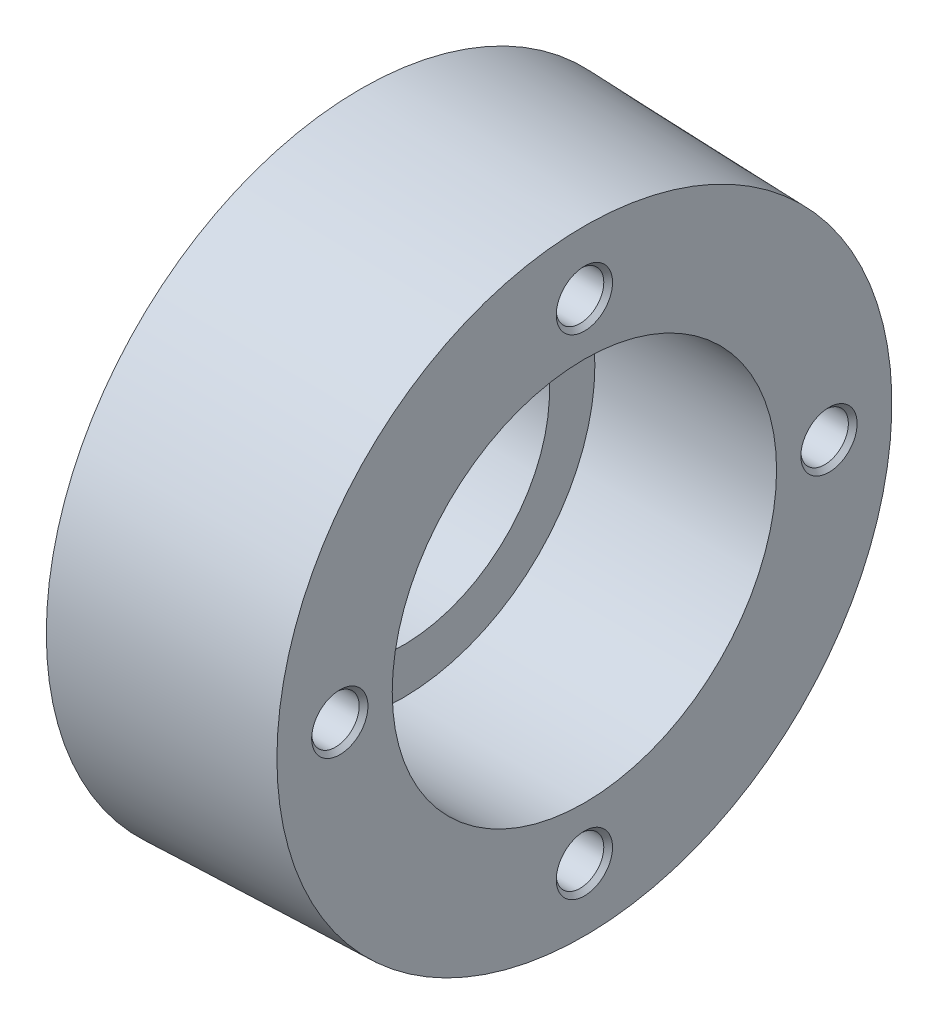
ISO-10303-21;
HEADER;
FILE_DESCRIPTION(('STEP AP214'),'2;1');
FILE_NAME('part.step','',(''),(''),'','','');
FILE_SCHEMA(('AUTOMOTIVE_DESIGN { 1 0 10303 214 1 1 1 1 }'));
ENDSEC;
DATA;
#1=APPLICATION_CONTEXT('core data for automotive mechanical design processes');
#2=APPLICATION_PROTOCOL_DEFINITION('international standard','automotive_design',2000,#1);
#3=PRODUCT_CONTEXT('',#1,'mechanical');
#4=PRODUCT('Part','Part','',(#3));
#5=PRODUCT_RELATED_PRODUCT_CATEGORY('part','',(#4));
#6=PRODUCT_DEFINITION_FORMATION('','',#4);
#7=PRODUCT_DEFINITION_CONTEXT('part definition',#1,'design');
#8=PRODUCT_DEFINITION('design','',#6,#7);
#9=PRODUCT_DEFINITION_SHAPE('','',#8);
#10=(LENGTH_UNIT() NAMED_UNIT(*) SI_UNIT(.MILLI.,.METRE.));
#11=(NAMED_UNIT(*) PLANE_ANGLE_UNIT() SI_UNIT($,.RADIAN.));
#12=(NAMED_UNIT(*) SI_UNIT($,.STERADIAN.) SOLID_ANGLE_UNIT());
#13=UNCERTAINTY_MEASURE_WITH_UNIT(LENGTH_MEASURE(1.E-05),#10,'distance_accuracy_value','');
#14=(GEOMETRIC_REPRESENTATION_CONTEXT(3) GLOBAL_UNCERTAINTY_ASSIGNED_CONTEXT((#13)) GLOBAL_UNIT_ASSIGNED_CONTEXT((#10,
#11,#12)) REPRESENTATION_CONTEXT('',''));
#15=CARTESIAN_POINT('',(0.,0.,0.));
#16=DIRECTION('',(0.,0.,1.));
#17=DIRECTION('',(1.,0.,0.));
#18=AXIS2_PLACEMENT_3D('',#15,#16,#17);
#19=CARTESIAN_POINT('',(0.,21.,0.));
#20=DIRECTION('',(1.,0.,0.));
#21=DIRECTION('',(0.,0.,-1.));
#22=AXIS2_PLACEMENT_3D('',#19,#20,#21);
#23=PLANE('',#22);
#24=CARTESIAN_POINT('',(0.,0.,0.));
#25=DIRECTION('',(-1.,0.,0.));
#26=DIRECTION('',(0.,0.,1.));
#27=AXIS2_PLACEMENT_3D('',#24,#25,#26);
#28=CIRCLE('',#27,21.);
#29=CARTESIAN_POINT('',(0.,0.,21.));
#30=VERTEX_POINT('',#29);
#31=EDGE_CURVE('E103',#30,#30,#28,.T.);
#32=ORIENTED_EDGE('',*,*,#31,.F.);
#33=EDGE_LOOP('',(#32));
#34=FACE_BOUND('',#33,.T.);
#35=CARTESIAN_POINT('',(0.,0.,0.));
#36=DIRECTION('',(-1.,0.,0.));
#37=DIRECTION('',(0.,0.,1.));
#38=AXIS2_PLACEMENT_3D('',#35,#36,#37);
#39=CIRCLE('',#38,28.);
#40=CARTESIAN_POINT('',(0.,0.,28.));
#41=VERTEX_POINT('',#40);
#42=EDGE_CURVE('E11',#41,#41,#39,.T.);
#43=ORIENTED_EDGE('',*,*,#42,.T.);
#44=EDGE_LOOP('',(#43));
#45=FACE_BOUND('',#44,.T.);
#46=ADVANCED_FACE('F39',(#34,#45),#23,.F.);
#47=CARTESIAN_POINT('',(0.,0.,0.));
#48=DIRECTION('',(-1.,0.,0.));
#49=DIRECTION('',(0.,0.,1.));
#50=AXIS2_PLACEMENT_3D('',#47,#48,#49);
#51=CYLINDRICAL_SURFACE('',#50,28.);
#52=ORIENTED_EDGE('',*,*,#42,.F.);
#53=EDGE_LOOP('',(#52));
#54=FACE_BOUND('',#53,.T.);
#55=CARTESIAN_POINT('',(5.,0.,0.));
#56=DIRECTION('',(-1.,0.,0.));
#57=DIRECTION('',(0.,0.,1.));
#58=AXIS2_PLACEMENT_3D('',#55,#56,#57);
#59=CIRCLE('',#58,28.);
#60=CARTESIAN_POINT('',(5.,0.,28.));
#61=VERTEX_POINT('',#60);
#62=EDGE_CURVE('E46',#61,#61,#59,.T.);
#63=ORIENTED_EDGE('',*,*,#62,.T.);
#64=EDGE_LOOP('',(#63));
#65=FACE_BOUND('',#64,.T.);
#66=ADVANCED_FACE('F123',(#54,#65),#51,.T.);
#67=CARTESIAN_POINT('',(5.,28.,0.));
#68=DIRECTION('',(1.,0.,0.));
#69=DIRECTION('',(0.,0.,-1.));
#70=AXIS2_PLACEMENT_3D('',#67,#68,#69);
#71=PLANE('',#70);
#72=ORIENTED_EDGE('',*,*,#62,.F.);
#73=EDGE_LOOP('',(#72));
#74=FACE_BOUND('',#73,.T.);
#75=CARTESIAN_POINT('',(5.,0.,0.));
#76=DIRECTION('',(-1.,0.,0.));
#77=DIRECTION('',(0.,0.,1.));
#78=AXIS2_PLACEMENT_3D('',#75,#76,#77);
#79=CIRCLE('',#78,45.);
#80=CARTESIAN_POINT('',(5.,0.,45.));
#81=VERTEX_POINT('',#80);
#82=EDGE_CURVE('E118',#81,#81,#79,.T.);
#83=ORIENTED_EDGE('',*,*,#82,.T.);
#84=EDGE_LOOP('',(#83));
#85=FACE_BOUND('',#84,.T.);
#86=ADVANCED_FACE('F125',(#74,#85),#71,.F.);
#87=CARTESIAN_POINT('',(37.,0.,0.));
#88=DIRECTION('',(-1.,0.,0.));
#89=DIRECTION('',(0.,0.,1.));
#90=AXIS2_PLACEMENT_3D('',#87,#88,#89);
#91=CONICAL_SURFACE('',#90,44.,0.0312398334302683);
#92=ORIENTED_EDGE('',*,*,#82,.F.);
#93=EDGE_LOOP('',(#92));
#94=FACE_BOUND('',#93,.T.);
#95=CARTESIAN_POINT('',(37.,0.,0.));
#96=DIRECTION('',(-1.,0.,0.));
#97=DIRECTION('',(0.,0.,1.));
#98=AXIS2_PLACEMENT_3D('',#95,#96,#97);
#99=CIRCLE('',#98,44.);
#100=CARTESIAN_POINT('',(37.,0.,44.));
#101=VERTEX_POINT('',#100);
#102=EDGE_CURVE('E115',#101,#101,#99,.T.);
#103=ORIENTED_EDGE('',*,*,#102,.T.);
#104=EDGE_LOOP('',(#103));
#105=FACE_BOUND('',#104,.T.);
#106=ADVANCED_FACE('F128',(#94,#105),#91,.T.);
#107=CARTESIAN_POINT('',(37.,44.,0.));
#108=DIRECTION('',(-1.,0.,0.));
#109=DIRECTION('',(0.,0.,1.));
#110=AXIS2_PLACEMENT_3D('',#107,#108,#109);
#111=PLANE('',#110);
#112=CARTESIAN_POINT('',(37.,3.66605540578529E-13,35.));
#113=DIRECTION('',(1.,0.,0.));
#114=DIRECTION('',(0.,0.,-1.));
#115=AXIS2_PLACEMENT_3D('',#112,#113,#114);
#116=CIRCLE('',#115,4.025);
#117=CARTESIAN_POINT('',(37.,3.66605540578529E-13,30.975));
#118=VERTEX_POINT('',#117);
#119=EDGE_CURVE('E76',#118,#118,#116,.T.);
#120=ORIENTED_EDGE('',*,*,#119,.F.);
#121=EDGE_LOOP('',(#120));
#122=FACE_BOUND('',#121,.T.);
#123=CARTESIAN_POINT('',(37.,-35.,0.));
#124=DIRECTION('',(1.,0.,0.));
#125=DIRECTION('',(0.,0.,-1.));
#126=AXIS2_PLACEMENT_3D('',#123,#124,#125);
#127=CIRCLE('',#126,4.025);
#128=CARTESIAN_POINT('',(37.,-35.,-4.025));
#129=VERTEX_POINT('',#128);
#130=EDGE_CURVE('E69',#129,#129,#127,.T.);
#131=ORIENTED_EDGE('',*,*,#130,.F.);
#132=EDGE_LOOP('',(#131));
#133=FACE_BOUND('',#132,.T.);
#134=CARTESIAN_POINT('',(37.,-1.2220184685951E-13,-35.));
#135=DIRECTION('',(1.,0.,0.));
#136=DIRECTION('',(0.,0.,-1.));
#137=AXIS2_PLACEMENT_3D('',#134,#135,#136);
#138=CIRCLE('',#137,4.025);
#139=CARTESIAN_POINT('',(37.,-1.2220184685951E-13,-39.025));
#140=VERTEX_POINT('',#139);
#141=EDGE_CURVE('E85',#140,#140,#138,.T.);
#142=ORIENTED_EDGE('',*,*,#141,.F.);
#143=EDGE_LOOP('',(#142));
#144=FACE_BOUND('',#143,.T.);
#145=CARTESIAN_POINT('',(37.,35.,0.));
#146=DIRECTION('',(1.,0.,0.));
#147=DIRECTION('',(0.,0.,-1.));
#148=AXIS2_PLACEMENT_3D('',#145,#146,#147);
#149=CIRCLE('',#148,4.025);
#150=CARTESIAN_POINT('',(37.,35.,-4.025));
#151=VERTEX_POINT('',#150);
#152=EDGE_CURVE('E94',#151,#151,#149,.T.);
#153=ORIENTED_EDGE('',*,*,#152,.F.);
#154=EDGE_LOOP('',(#153));
#155=FACE_BOUND('',#154,.T.);
#156=ORIENTED_EDGE('',*,*,#102,.F.);
#157=EDGE_LOOP('',(#156));
#158=FACE_BOUND('',#157,.T.);
#159=CARTESIAN_POINT('',(37.,0.,0.));
#160=DIRECTION('',(-1.,0.,0.));
#161=DIRECTION('',(0.,0.,1.));
#162=AXIS2_PLACEMENT_3D('',#159,#160,#161);
#163=CIRCLE('',#162,27.5);
#164=CARTESIAN_POINT('',(37.,0.,27.5));
#165=VERTEX_POINT('',#164);
#166=EDGE_CURVE('E112',#165,#165,#163,.T.);
#167=ORIENTED_EDGE('',*,*,#166,.T.);
#168=EDGE_LOOP('',(#167));
#169=FACE_BOUND('',#168,.T.);
#170=ADVANCED_FACE('F134',(#122,#133,#144,#155,#158,#169),#111,.F.);
#171=CARTESIAN_POINT('',(0.,0.,0.));
#172=DIRECTION('',(-1.,0.,0.));
#173=DIRECTION('',(0.,0.,1.));
#174=AXIS2_PLACEMENT_3D('',#171,#172,#173);
#175=CYLINDRICAL_SURFACE('',#174,27.5);
#176=ORIENTED_EDGE('',*,*,#166,.F.);
#177=EDGE_LOOP('',(#176));
#178=FACE_BOUND('',#177,.T.);
#179=CARTESIAN_POINT('',(11.,0.,0.));
#180=DIRECTION('',(-1.,0.,0.));
#181=DIRECTION('',(0.,0.,1.));
#182=AXIS2_PLACEMENT_3D('',#179,#180,#181);
#183=CIRCLE('',#182,27.5);
#184=CARTESIAN_POINT('',(11.,0.,27.5));
#185=VERTEX_POINT('',#184);
#186=EDGE_CURVE('E109',#185,#185,#183,.T.);
#187=ORIENTED_EDGE('',*,*,#186,.T.);
#188=EDGE_LOOP('',(#187));
#189=FACE_BOUND('',#188,.T.);
#190=ADVANCED_FACE('F140',(#178,#189),#175,.F.);
#191=CARTESIAN_POINT('',(11.,27.5,0.));
#192=DIRECTION('',(-1.,0.,0.));
#193=DIRECTION('',(0.,0.,1.));
#194=AXIS2_PLACEMENT_3D('',#191,#192,#193);
#195=PLANE('',#194);
#196=ORIENTED_EDGE('',*,*,#186,.F.);
#197=EDGE_LOOP('',(#196));
#198=FACE_BOUND('',#197,.T.);
#199=CARTESIAN_POINT('',(11.,0.,0.));
#200=DIRECTION('',(-1.,0.,0.));
#201=DIRECTION('',(0.,0.,1.));
#202=AXIS2_PLACEMENT_3D('',#199,#200,#201);
#203=CIRCLE('',#202,21.);
#204=CARTESIAN_POINT('',(11.,0.,21.));
#205=VERTEX_POINT('',#204);
#206=EDGE_CURVE('E106',#205,#205,#203,.T.);
#207=ORIENTED_EDGE('',*,*,#206,.T.);
#208=EDGE_LOOP('',(#207));
#209=FACE_BOUND('',#208,.T.);
#210=ADVANCED_FACE('F147',(#198,#209),#195,.F.);
#211=CARTESIAN_POINT('',(0.,0.,0.));
#212=DIRECTION('',(-1.,0.,0.));
#213=DIRECTION('',(0.,0.,1.));
#214=AXIS2_PLACEMENT_3D('',#211,#212,#213);
#215=CYLINDRICAL_SURFACE('',#214,21.);
#216=ORIENTED_EDGE('',*,*,#206,.F.);
#217=EDGE_LOOP('',(#216));
#218=FACE_BOUND('',#217,.T.);
#219=ORIENTED_EDGE('',*,*,#31,.T.);
#220=EDGE_LOOP('',(#219));
#221=FACE_BOUND('',#220,.T.);
#222=ADVANCED_FACE('F153',(#218,#221),#215,.F.);
#223=CARTESIAN_POINT('',(14.75,35.,0.));
#224=DIRECTION('',(1.,0.,0.));
#225=DIRECTION('',(0.,0.,-1.));
#226=AXIS2_PLACEMENT_3D('',#223,#224,#225);
#227=CONICAL_SURFACE('',#226,3.39999999999999,1.02974425867665);
#228=CARTESIAN_POINT('',(12.7070738953063,35.,0.));
#229=VERTEX_POINT('',#228);
#230=VERTEX_LOOP('',#229);
#231=FACE_BOUND('',#230,.T.);
#232=CARTESIAN_POINT('',(14.75,35.,0.));
#233=DIRECTION('',(1.,0.,0.));
#234=DIRECTION('',(0.,0.,-1.));
#235=AXIS2_PLACEMENT_3D('',#232,#233,#234);
#236=CIRCLE('',#235,3.39999999999999);
#237=CARTESIAN_POINT('',(14.75,35.,-3.39999999999999));
#238=VERTEX_POINT('',#237);
#239=EDGE_CURVE('E100',#238,#238,#236,.T.);
#240=ORIENTED_EDGE('',*,*,#239,.T.);
#241=EDGE_LOOP('',(#240));
#242=FACE_BOUND('',#241,.T.);
#243=ADVANCED_FACE('F159',(#231,#242),#227,.F.);
#244=CARTESIAN_POINT('',(37.,35.,0.));
#245=DIRECTION('',(1.,0.,0.));
#246=DIRECTION('',(0.,0.,-1.));
#247=AXIS2_PLACEMENT_3D('',#244,#245,#246);
#248=CYLINDRICAL_SURFACE('',#247,3.39999999999999);
#249=ORIENTED_EDGE('',*,*,#239,.F.);
#250=EDGE_LOOP('',(#249));
#251=FACE_BOUND('',#250,.T.);
#252=CARTESIAN_POINT('',(36.375,35.,0.));
#253=DIRECTION('',(1.,0.,0.));
#254=DIRECTION('',(0.,0.,-1.));
#255=AXIS2_PLACEMENT_3D('',#252,#253,#254);
#256=CIRCLE('',#255,3.4);
#257=CARTESIAN_POINT('',(36.375,35.,-3.4));
#258=VERTEX_POINT('',#257);
#259=EDGE_CURVE('E97',#258,#258,#256,.T.);
#260=ORIENTED_EDGE('',*,*,#259,.T.);
#261=EDGE_LOOP('',(#260));
#262=FACE_BOUND('',#261,.T.);
#263=ADVANCED_FACE('F173',(#251,#262),#248,.F.);
#264=CARTESIAN_POINT('',(37.,35.,0.));
#265=DIRECTION('',(1.,0.,0.));
#266=DIRECTION('',(0.,0.,-1.));
#267=AXIS2_PLACEMENT_3D('',#264,#265,#266);
#268=CONICAL_SURFACE('',#267,4.025,0.785398163397448);
#269=ORIENTED_EDGE('',*,*,#259,.F.);
#270=EDGE_LOOP('',(#269));
#271=FACE_BOUND('',#270,.T.);
#272=ORIENTED_EDGE('',*,*,#152,.T.);
#273=EDGE_LOOP('',(#272));
#274=FACE_BOUND('',#273,.T.);
#275=ADVANCED_FACE('F176',(#271,#274),#268,.F.);
#276=CARTESIAN_POINT('',(14.75,-1.2220184685951E-13,-35.));
#277=DIRECTION('',(1.,0.,0.));
#278=DIRECTION('',(0.,0.,-1.));
#279=AXIS2_PLACEMENT_3D('',#276,#277,#278);
#280=CONICAL_SURFACE('',#279,3.39999999999998,1.02974425867665);
#281=CARTESIAN_POINT('',(12.7070738953063,-1.28151897698717E-13,-35.));
#282=VERTEX_POINT('',#281);
#283=VERTEX_LOOP('',#282);
#284=FACE_BOUND('',#283,.T.);
#285=CARTESIAN_POINT('',(14.75,-1.2220184685951E-13,-35.));
#286=DIRECTION('',(1.,0.,0.));
#287=DIRECTION('',(0.,0.,-1.));
#288=AXIS2_PLACEMENT_3D('',#285,#286,#287);
#289=CIRCLE('',#288,3.39999999999998);
#290=CARTESIAN_POINT('',(14.75,-1.2220184685951E-13,-38.4));
#291=VERTEX_POINT('',#290);
#292=EDGE_CURVE('E91',#291,#291,#289,.T.);
#293=ORIENTED_EDGE('',*,*,#292,.T.);
#294=EDGE_LOOP('',(#293));
#295=FACE_BOUND('',#294,.T.);
#296=ADVANCED_FACE('F180',(#284,#295),#280,.F.);
#297=CARTESIAN_POINT('',(37.,-1.2220184685951E-13,-35.));
#298=DIRECTION('',(1.,0.,0.));
#299=DIRECTION('',(0.,0.,-1.));
#300=AXIS2_PLACEMENT_3D('',#297,#298,#299);
#301=CYLINDRICAL_SURFACE('',#300,3.39999999999999);
#302=ORIENTED_EDGE('',*,*,#292,.F.);
#303=EDGE_LOOP('',(#302));
#304=FACE_BOUND('',#303,.T.);
#305=CARTESIAN_POINT('',(36.375,-1.2220184685951E-13,-35.));
#306=DIRECTION('',(1.,0.,0.));
#307=DIRECTION('',(0.,0.,-1.));
#308=AXIS2_PLACEMENT_3D('',#305,#306,#307);
#309=CIRCLE('',#308,3.4);
#310=CARTESIAN_POINT('',(36.375,-1.2220184685951E-13,-38.4));
#311=VERTEX_POINT('',#310);
#312=EDGE_CURVE('E88',#311,#311,#309,.T.);
#313=ORIENTED_EDGE('',*,*,#312,.T.);
#314=EDGE_LOOP('',(#313));
#315=FACE_BOUND('',#314,.T.);
#316=ADVANCED_FACE('F184',(#304,#315),#301,.F.);
#317=CARTESIAN_POINT('',(37.,-1.2220184685951E-13,-35.));
#318=DIRECTION('',(1.,0.,0.));
#319=DIRECTION('',(0.,0.,-1.));
#320=AXIS2_PLACEMENT_3D('',#317,#318,#319);
#321=CONICAL_SURFACE('',#320,4.025,0.785398163397451);
#322=ORIENTED_EDGE('',*,*,#312,.F.);
#323=EDGE_LOOP('',(#322));
#324=FACE_BOUND('',#323,.T.);
#325=ORIENTED_EDGE('',*,*,#141,.T.);
#326=EDGE_LOOP('',(#325));
#327=FACE_BOUND('',#326,.T.);
#328=ADVANCED_FACE('F187',(#324,#327),#321,.F.);
#329=CARTESIAN_POINT('',(14.75,-35.,0.));
#330=DIRECTION('',(1.,0.,0.));
#331=DIRECTION('',(0.,0.,-1.));
#332=AXIS2_PLACEMENT_3D('',#329,#330,#331);
#333=CONICAL_SURFACE('',#332,3.39999999999999,1.02974425867665);
#334=CARTESIAN_POINT('',(12.7070738953063,-35.,0.));
#335=VERTEX_POINT('',#334);
#336=VERTEX_LOOP('',#335);
#337=FACE_BOUND('',#336,.T.);
#338=CARTESIAN_POINT('',(14.75,-35.,0.));
#339=DIRECTION('',(1.,0.,0.));
#340=DIRECTION('',(0.,0.,-1.));
#341=AXIS2_PLACEMENT_3D('',#338,#339,#340);
#342=CIRCLE('',#341,3.39999999999999);
#343=CARTESIAN_POINT('',(14.75,-35.,-3.39999999999999));
#344=VERTEX_POINT('',#343);
#345=EDGE_CURVE('E82',#344,#344,#342,.T.);
#346=ORIENTED_EDGE('',*,*,#345,.T.);
#347=EDGE_LOOP('',(#346));
#348=FACE_BOUND('',#347,.T.);
#349=ADVANCED_FACE('F191',(#337,#348),#333,.F.);
#350=CARTESIAN_POINT('',(37.,-35.,0.));
#351=DIRECTION('',(1.,0.,0.));
#352=DIRECTION('',(0.,0.,-1.));
#353=AXIS2_PLACEMENT_3D('',#350,#351,#352);
#354=CYLINDRICAL_SURFACE('',#353,3.39999999999999);
#355=ORIENTED_EDGE('',*,*,#345,.F.);
#356=EDGE_LOOP('',(#355));
#357=FACE_BOUND('',#356,.T.);
#358=CARTESIAN_POINT('',(36.375,-35.,0.));
#359=DIRECTION('',(1.,0.,0.));
#360=DIRECTION('',(0.,0.,-1.));
#361=AXIS2_PLACEMENT_3D('',#358,#359,#360);
#362=CIRCLE('',#361,3.4);
#363=CARTESIAN_POINT('',(36.375,-35.,-3.4));
#364=VERTEX_POINT('',#363);
#365=EDGE_CURVE('E73',#364,#364,#362,.T.);
#366=ORIENTED_EDGE('',*,*,#365,.T.);
#367=EDGE_LOOP('',(#366));
#368=FACE_BOUND('',#367,.T.);
#369=ADVANCED_FACE('F195',(#357,#368),#354,.F.);
#370=CARTESIAN_POINT('',(37.,-35.,0.));
#371=DIRECTION('',(1.,0.,0.));
#372=DIRECTION('',(0.,0.,-1.));
#373=AXIS2_PLACEMENT_3D('',#370,#371,#372);
#374=CONICAL_SURFACE('',#373,4.025,0.785398163397448);
#375=ORIENTED_EDGE('',*,*,#365,.F.);
#376=EDGE_LOOP('',(#375));
#377=FACE_BOUND('',#376,.T.);
#378=ORIENTED_EDGE('',*,*,#130,.T.);
#379=EDGE_LOOP('',(#378));
#380=FACE_BOUND('',#379,.T.);
#381=ADVANCED_FACE('F63',(#377,#380),#374,.F.);
#382=CARTESIAN_POINT('',(14.75,3.66605540578529E-13,35.));
#383=DIRECTION('',(1.,0.,0.));
#384=DIRECTION('',(0.,0.,-1.));
#385=AXIS2_PLACEMENT_3D('',#382,#383,#384);
#386=CONICAL_SURFACE('',#385,3.39999999999998,1.02974425867665);
#387=CARTESIAN_POINT('',(12.7070738953063,3.60655489739322E-13,35.));
#388=VERTEX_POINT('',#387);
#389=VERTEX_LOOP('',#388);
#390=FACE_BOUND('',#389,.T.);
#391=CARTESIAN_POINT('',(14.75,3.66605540578529E-13,35.));
#392=DIRECTION('',(1.,0.,0.));
#393=DIRECTION('',(0.,0.,-1.));
#394=AXIS2_PLACEMENT_3D('',#391,#392,#393);
#395=CIRCLE('',#394,3.39999999999998);
#396=CARTESIAN_POINT('',(14.75,3.66605540578529E-13,31.6));
#397=VERTEX_POINT('',#396);
#398=EDGE_CURVE('E67',#397,#397,#395,.T.);
#399=ORIENTED_EDGE('',*,*,#398,.T.);
#400=EDGE_LOOP('',(#399));
#401=FACE_BOUND('',#400,.T.);
#402=ADVANCED_FACE('F59',(#390,#401),#386,.F.);
#403=CARTESIAN_POINT('',(37.,3.66605540578529E-13,35.));
#404=DIRECTION('',(1.,0.,0.));
#405=DIRECTION('',(0.,0.,-1.));
#406=AXIS2_PLACEMENT_3D('',#403,#404,#405);
#407=CYLINDRICAL_SURFACE('',#406,3.39999999999999);
#408=ORIENTED_EDGE('',*,*,#398,.F.);
#409=EDGE_LOOP('',(#408));
#410=FACE_BOUND('',#409,.T.);
#411=CARTESIAN_POINT('',(36.375,3.66605540578529E-13,35.));
#412=DIRECTION('',(1.,0.,0.));
#413=DIRECTION('',(0.,0.,-1.));
#414=AXIS2_PLACEMENT_3D('',#411,#412,#413);
#415=CIRCLE('',#414,3.4);
#416=CARTESIAN_POINT('',(36.375,3.66605540578529E-13,31.6));
#417=VERTEX_POINT('',#416);
#418=EDGE_CURVE('E70',#417,#417,#415,.T.);
#419=ORIENTED_EDGE('',*,*,#418,.T.);
#420=EDGE_LOOP('',(#419));
#421=FACE_BOUND('',#420,.T.);
#422=ADVANCED_FACE('F62',(#410,#421),#407,.F.);
#423=CARTESIAN_POINT('',(37.,3.66605540578529E-13,35.));
#424=DIRECTION('',(1.,0.,0.));
#425=DIRECTION('',(0.,0.,-1.));
#426=AXIS2_PLACEMENT_3D('',#423,#424,#425);
#427=CONICAL_SURFACE('',#426,4.025,0.785398163397451);
#428=ORIENTED_EDGE('',*,*,#418,.F.);
#429=EDGE_LOOP('',(#428));
#430=FACE_BOUND('',#429,.T.);
#431=ORIENTED_EDGE('',*,*,#119,.T.);
#432=EDGE_LOOP('',(#431));
#433=FACE_BOUND('',#432,.T.);
#434=ADVANCED_FACE('F205',(#430,#433),#427,.F.);
#435=CLOSED_SHELL('',(#46,#66,#86,#106,#170,#190,#210,#222,#243,#263,#275,#296,#316,#328,#349,
#369,#381,#402,#422,#434));
#436=MANIFOLD_SOLID_BREP('B2',#435);
#437=ADVANCED_BREP_SHAPE_REPRESENTATION('',(#18,#436),#14);
#438=SHAPE_DEFINITION_REPRESENTATION(#9,#437);
ENDSEC;
END-ISO-10303-21;
